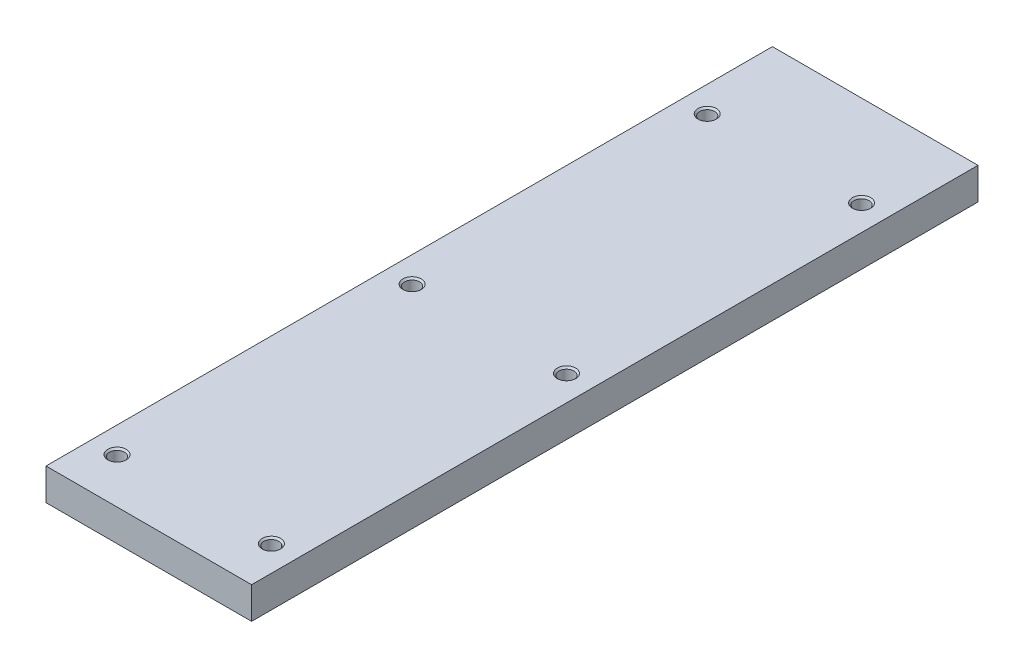
ISO-10303-21;
HEADER;
FILE_DESCRIPTION(('STEP AP214'),'2;1');
FILE_NAME('part.step','',(''),(''),'','','');
FILE_SCHEMA(('AUTOMOTIVE_DESIGN { 1 0 10303 214 1 1 1 1 }'));
ENDSEC;
DATA;
#1=APPLICATION_CONTEXT('core data for automotive mechanical design processes');
#2=APPLICATION_PROTOCOL_DEFINITION('international standard','automotive_design',2000,#1);
#3=PRODUCT_CONTEXT('',#1,'mechanical');
#4=PRODUCT('Part','Part','',(#3));
#5=PRODUCT_RELATED_PRODUCT_CATEGORY('part','',(#4));
#6=PRODUCT_DEFINITION_FORMATION('','',#4);
#7=PRODUCT_DEFINITION_CONTEXT('part definition',#1,'design');
#8=PRODUCT_DEFINITION('design','',#6,#7);
#9=PRODUCT_DEFINITION_SHAPE('','',#8);
#10=(LENGTH_UNIT() NAMED_UNIT(*) SI_UNIT(.MILLI.,.METRE.));
#11=(NAMED_UNIT(*) PLANE_ANGLE_UNIT() SI_UNIT($,.RADIAN.));
#12=(NAMED_UNIT(*) SI_UNIT($,.STERADIAN.) SOLID_ANGLE_UNIT());
#13=UNCERTAINTY_MEASURE_WITH_UNIT(LENGTH_MEASURE(1.E-05),#10,'distance_accuracy_value','');
#14=(GEOMETRIC_REPRESENTATION_CONTEXT(3) GLOBAL_UNCERTAINTY_ASSIGNED_CONTEXT((#13)) GLOBAL_UNIT_ASSIGNED_CONTEXT((#10,
#11,#12)) REPRESENTATION_CONTEXT('',''));
#15=CARTESIAN_POINT('',(0.,0.,0.));
#16=DIRECTION('',(0.,0.,1.));
#17=DIRECTION('',(1.,0.,0.));
#18=AXIS2_PLACEMENT_3D('',#15,#16,#17);
#19=CARTESIAN_POINT('',(-28.1439837484486,-5.96999999999999,205.825756949559));
#20=DIRECTION('',(1.,0.,0.));
#21=DIRECTION('',(0.,0.,-1.));
#22=AXIS2_PLACEMENT_3D('',#19,#20,#21);
#23=PLANE('',#22);
#24=DIRECTION('',(0.,-1.,0.));
#25=VECTOR('',#24,1.);
#26=CARTESIAN_POINT('',(-28.1439837484486,-5.96999999999999,160.));
#27=LINE('',#26,#25);
#28=CARTESIAN_POINT('',(-28.1439837484486,-5.96999999999999,160.));
#29=VERTEX_POINT('',#28);
#30=CARTESIAN_POINT('',(-28.1439837484486,-12.97,160.));
#31=VERTEX_POINT('',#30);
#32=EDGE_CURVE('E56',#29,#31,#27,.T.);
#33=ORIENTED_EDGE('',*,*,#32,.F.);
#34=DIRECTION('',(0.,0.,-1.));
#35=VECTOR('',#34,1.);
#36=CARTESIAN_POINT('',(-28.1439837484486,-5.96999999999999,205.825756949559));
#37=LINE('',#36,#35);
#38=CARTESIAN_POINT('',(-28.1439837484486,-5.96999999999999,0.));
#39=VERTEX_POINT('',#38);
#40=EDGE_CURVE('E51',#29,#39,#37,.T.);
#41=ORIENTED_EDGE('',*,*,#40,.T.);
#42=DIRECTION('',(0.,-1.,0.));
#43=VECTOR('',#42,1.);
#44=CARTESIAN_POINT('',(-28.1439837484486,-5.96999999999999,0.));
#45=LINE('',#44,#43);
#46=CARTESIAN_POINT('',(-28.1439837484486,-12.97,0.));
#47=VERTEX_POINT('',#46);
#48=EDGE_CURVE('E113',#39,#47,#45,.T.);
#49=ORIENTED_EDGE('',*,*,#48,.T.);
#50=DIRECTION('',(0.,0.,-1.));
#51=VECTOR('',#50,1.);
#52=CARTESIAN_POINT('',(-28.1439837484486,-12.97,205.825756949559));
#53=LINE('',#52,#51);
#54=EDGE_CURVE('E85',#31,#47,#53,.T.);
#55=ORIENTED_EDGE('',*,*,#54,.F.);
#56=EDGE_LOOP('',(#33,#41,#49,#55));
#57=FACE_BOUND('',#56,.T.);
#58=ADVANCED_FACE('F47',(#57),#23,.F.);
#59=CARTESIAN_POINT('',(-28.1439837484486,-12.97,205.825756949559));
#60=DIRECTION('',(0.,1.,0.));
#61=DIRECTION('',(0.,0.,1.));
#62=AXIS2_PLACEMENT_3D('',#59,#60,#61);
#63=PLANE('',#62);
#64=CARTESIAN_POINT('',(-22.5,-12.97,20.));
#65=DIRECTION('',(0.,1.,0.));
#66=DIRECTION('',(0.,0.,1.));
#67=AXIS2_PLACEMENT_3D('',#64,#65,#66);
#68=CIRCLE('',#67,1.65);
#69=CARTESIAN_POINT('',(-22.5,-12.97,21.65));
#70=VERTEX_POINT('',#69);
#71=EDGE_CURVE('E171',#70,#70,#68,.T.);
#72=ORIENTED_EDGE('',*,*,#71,.T.);
#73=EDGE_LOOP('',(#72));
#74=FACE_BOUND('',#73,.T.);
#75=CARTESIAN_POINT('',(-22.5,-12.97,85.));
#76=DIRECTION('',(0.,1.,0.));
#77=DIRECTION('',(0.,0.,1.));
#78=AXIS2_PLACEMENT_3D('',#75,#76,#77);
#79=CIRCLE('',#78,1.65);
#80=CARTESIAN_POINT('',(-22.5,-12.97,86.65));
#81=VERTEX_POINT('',#80);
#82=EDGE_CURVE('E162',#81,#81,#79,.T.);
#83=ORIENTED_EDGE('',*,*,#82,.T.);
#84=EDGE_LOOP('',(#83));
#85=FACE_BOUND('',#84,.T.);
#86=CARTESIAN_POINT('',(-22.5000000000001,-12.97,150.));
#87=DIRECTION('',(0.,1.,0.));
#88=DIRECTION('',(0.,0.,1.));
#89=AXIS2_PLACEMENT_3D('',#86,#87,#88);
#90=CIRCLE('',#89,1.65);
#91=CARTESIAN_POINT('',(-22.5000000000001,-12.97,151.65));
#92=VERTEX_POINT('',#91);
#93=EDGE_CURVE('E153',#92,#92,#90,.T.);
#94=ORIENTED_EDGE('',*,*,#93,.T.);
#95=EDGE_LOOP('',(#94));
#96=FACE_BOUND('',#95,.T.);
#97=CARTESIAN_POINT('',(11.5,-12.97,150.));
#98=DIRECTION('',(0.,1.,0.));
#99=DIRECTION('',(0.,0.,1.));
#100=AXIS2_PLACEMENT_3D('',#97,#98,#99);
#101=CIRCLE('',#100,1.65);
#102=CARTESIAN_POINT('',(11.5,-12.97,151.65));
#103=VERTEX_POINT('',#102);
#104=EDGE_CURVE('E144',#103,#103,#101,.T.);
#105=ORIENTED_EDGE('',*,*,#104,.T.);
#106=EDGE_LOOP('',(#105));
#107=FACE_BOUND('',#106,.T.);
#108=CARTESIAN_POINT('',(11.5,-12.97,85.));
#109=DIRECTION('',(0.,1.,0.));
#110=DIRECTION('',(0.,0.,1.));
#111=AXIS2_PLACEMENT_3D('',#108,#109,#110);
#112=CIRCLE('',#111,1.65);
#113=CARTESIAN_POINT('',(11.5,-12.97,86.65));
#114=VERTEX_POINT('',#113);
#115=EDGE_CURVE('E133',#114,#114,#112,.T.);
#116=ORIENTED_EDGE('',*,*,#115,.T.);
#117=EDGE_LOOP('',(#116));
#118=FACE_BOUND('',#117,.T.);
#119=CARTESIAN_POINT('',(11.5,-12.97,20.));
#120=DIRECTION('',(0.,1.,0.));
#121=DIRECTION('',(0.,0.,1.));
#122=AXIS2_PLACEMENT_3D('',#119,#120,#121);
#123=CIRCLE('',#122,1.65);
#124=CARTESIAN_POINT('',(11.5,-12.97,21.65));
#125=VERTEX_POINT('',#124);
#126=EDGE_CURVE('E119',#125,#125,#123,.T.);
#127=ORIENTED_EDGE('',*,*,#126,.T.);
#128=EDGE_LOOP('',(#127));
#129=FACE_BOUND('',#128,.T.);
#130=DIRECTION('',(1.,0.,0.));
#131=VECTOR('',#130,1.);
#132=CARTESIAN_POINT('',(-28.1439837484486,-12.97,160.));
#133=LINE('',#132,#131);
#134=CARTESIAN_POINT('',(17.1439837484486,-12.97,160.));
#135=VERTEX_POINT('',#134);
#136=EDGE_CURVE('E13',#31,#135,#133,.T.);
#137=ORIENTED_EDGE('',*,*,#136,.F.);
#138=ORIENTED_EDGE('',*,*,#54,.T.);
#139=DIRECTION('',(1.,0.,0.));
#140=VECTOR('',#139,1.);
#141=CARTESIAN_POINT('',(-28.1439837484486,-12.97,0.));
#142=LINE('',#141,#140);
#143=CARTESIAN_POINT('',(17.1439837484486,-12.97,0.));
#144=VERTEX_POINT('',#143);
#145=EDGE_CURVE('E101',#47,#144,#142,.T.);
#146=ORIENTED_EDGE('',*,*,#145,.T.);
#147=DIRECTION('',(0.,0.,-1.));
#148=VECTOR('',#147,1.);
#149=CARTESIAN_POINT('',(17.1439837484486,-12.97,205.825756949559));
#150=LINE('',#149,#148);
#151=EDGE_CURVE('E98',#135,#144,#150,.T.);
#152=ORIENTED_EDGE('',*,*,#151,.F.);
#153=EDGE_LOOP('',(#137,#138,#146,#152));
#154=FACE_BOUND('',#153,.T.);
#155=ADVANCED_FACE('F103',(#74,#85,#96,#107,#118,#129,#154),#63,.F.);
#156=CARTESIAN_POINT('',(17.1439837484486,-5.96999999999999,205.825756949559));
#157=DIRECTION('',(1.,0.,0.));
#158=DIRECTION('',(0.,0.,-1.));
#159=AXIS2_PLACEMENT_3D('',#156,#157,#158);
#160=PLANE('',#159);
#161=DIRECTION('',(0.,0.,-1.));
#162=VECTOR('',#161,1.);
#163=CARTESIAN_POINT('',(17.1439837484486,-5.96999999999999,205.825756949559));
#164=LINE('',#163,#162);
#165=CARTESIAN_POINT('',(17.1439837484486,-5.96999999999999,160.));
#166=VERTEX_POINT('',#165);
#167=CARTESIAN_POINT('',(17.1439837484486,-5.96999999999999,0.));
#168=VERTEX_POINT('',#167);
#169=EDGE_CURVE('E69',#166,#168,#164,.T.);
#170=ORIENTED_EDGE('',*,*,#169,.F.);
#171=DIRECTION('',(0.,-1.,0.));
#172=VECTOR('',#171,1.);
#173=CARTESIAN_POINT('',(17.1439837484486,-5.96999999999999,160.));
#174=LINE('',#173,#172);
#175=EDGE_CURVE('E95',#166,#135,#174,.T.);
#176=ORIENTED_EDGE('',*,*,#175,.T.);
#177=ORIENTED_EDGE('',*,*,#151,.T.);
#178=DIRECTION('',(0.,-1.,0.));
#179=VECTOR('',#178,1.);
#180=CARTESIAN_POINT('',(17.1439837484486,-5.96999999999999,0.));
#181=LINE('',#180,#179);
#182=EDGE_CURVE('E110',#168,#144,#181,.T.);
#183=ORIENTED_EDGE('',*,*,#182,.F.);
#184=EDGE_LOOP('',(#170,#176,#177,#183));
#185=FACE_BOUND('',#184,.T.);
#186=ADVANCED_FACE('F96',(#185),#160,.T.);
#187=CARTESIAN_POINT('',(17.1439837484486,-5.96999999999999,205.825756949559));
#188=DIRECTION('',(0.,-1.,0.));
#189=DIRECTION('',(0.,0.,-1.));
#190=AXIS2_PLACEMENT_3D('',#187,#188,#189);
#191=PLANE('',#190);
#192=CARTESIAN_POINT('',(-22.5,-5.97,20.));
#193=DIRECTION('',(0.,1.,0.));
#194=DIRECTION('',(0.,0.,1.));
#195=AXIS2_PLACEMENT_3D('',#192,#193,#194);
#196=CIRCLE('',#195,2.025);
#197=CARTESIAN_POINT('',(-22.5,-5.97,22.025));
#198=VERTEX_POINT('',#197);
#199=EDGE_CURVE('E177',#198,#198,#196,.T.);
#200=ORIENTED_EDGE('',*,*,#199,.F.);
#201=EDGE_LOOP('',(#200));
#202=FACE_BOUND('',#201,.T.);
#203=CARTESIAN_POINT('',(-22.5,-5.97,85.));
#204=DIRECTION('',(0.,1.,0.));
#205=DIRECTION('',(0.,0.,1.));
#206=AXIS2_PLACEMENT_3D('',#203,#204,#205);
#207=CIRCLE('',#206,2.025);
#208=CARTESIAN_POINT('',(-22.5,-5.97,87.025));
#209=VERTEX_POINT('',#208);
#210=EDGE_CURVE('E168',#209,#209,#207,.T.);
#211=ORIENTED_EDGE('',*,*,#210,.F.);
#212=EDGE_LOOP('',(#211));
#213=FACE_BOUND('',#212,.T.);
#214=CARTESIAN_POINT('',(-22.5000000000001,-5.97,150.));
#215=DIRECTION('',(0.,1.,0.));
#216=DIRECTION('',(0.,0.,1.));
#217=AXIS2_PLACEMENT_3D('',#214,#215,#216);
#218=CIRCLE('',#217,2.025);
#219=CARTESIAN_POINT('',(-22.5000000000001,-5.97,152.025));
#220=VERTEX_POINT('',#219);
#221=EDGE_CURVE('E159',#220,#220,#218,.T.);
#222=ORIENTED_EDGE('',*,*,#221,.F.);
#223=EDGE_LOOP('',(#222));
#224=FACE_BOUND('',#223,.T.);
#225=CARTESIAN_POINT('',(11.5,-5.96999999999999,150.));
#226=DIRECTION('',(0.,1.,0.));
#227=DIRECTION('',(0.,0.,1.));
#228=AXIS2_PLACEMENT_3D('',#225,#226,#227);
#229=CIRCLE('',#228,2.025);
#230=CARTESIAN_POINT('',(11.5,-5.96999999999999,152.025));
#231=VERTEX_POINT('',#230);
#232=EDGE_CURVE('E150',#231,#231,#229,.T.);
#233=ORIENTED_EDGE('',*,*,#232,.F.);
#234=EDGE_LOOP('',(#233));
#235=FACE_BOUND('',#234,.T.);
#236=CARTESIAN_POINT('',(11.5,-5.96999999999999,85.));
#237=DIRECTION('',(0.,1.,0.));
#238=DIRECTION('',(0.,0.,1.));
#239=AXIS2_PLACEMENT_3D('',#236,#237,#238);
#240=CIRCLE('',#239,2.025);
#241=CARTESIAN_POINT('',(11.5,-5.96999999999999,87.025));
#242=VERTEX_POINT('',#241);
#243=EDGE_CURVE('E141',#242,#242,#240,.T.);
#244=ORIENTED_EDGE('',*,*,#243,.F.);
#245=EDGE_LOOP('',(#244));
#246=FACE_BOUND('',#245,.T.);
#247=CARTESIAN_POINT('',(11.5,-5.96999999999999,20.));
#248=DIRECTION('',(0.,1.,0.));
#249=DIRECTION('',(0.,0.,1.));
#250=AXIS2_PLACEMENT_3D('',#247,#248,#249);
#251=CIRCLE('',#250,2.025);
#252=CARTESIAN_POINT('',(11.5,-5.96999999999999,22.025));
#253=VERTEX_POINT('',#252);
#254=EDGE_CURVE('E129',#253,#253,#251,.T.);
#255=ORIENTED_EDGE('',*,*,#254,.F.);
#256=EDGE_LOOP('',(#255));
#257=FACE_BOUND('',#256,.T.);
#258=DIRECTION('',(-1.,0.,0.));
#259=VECTOR('',#258,1.);
#260=CARTESIAN_POINT('',(17.1439837484486,-5.96999999999999,160.));
#261=LINE('',#260,#259);
#262=EDGE_CURVE('E107',#166,#29,#261,.T.);
#263=ORIENTED_EDGE('',*,*,#262,.F.);
#264=ORIENTED_EDGE('',*,*,#169,.T.);
#265=DIRECTION('',(-1.,0.,0.));
#266=VECTOR('',#265,1.);
#267=CARTESIAN_POINT('',(17.1439837484486,-5.96999999999999,0.));
#268=LINE('',#267,#266);
#269=EDGE_CURVE('E114',#168,#39,#268,.T.);
#270=ORIENTED_EDGE('',*,*,#269,.T.);
#271=ORIENTED_EDGE('',*,*,#40,.F.);
#272=EDGE_LOOP('',(#263,#264,#270,#271));
#273=FACE_BOUND('',#272,.T.);
#274=ADVANCED_FACE('F195',(#202,#213,#224,#235,#246,#257,#273),#191,.F.);
#275=CARTESIAN_POINT('',(0.,0.,0.));
#276=DIRECTION('',(0.,0.,1.));
#277=DIRECTION('',(1.,0.,0.));
#278=AXIS2_PLACEMENT_3D('',#275,#276,#277);
#279=PLANE('',#278);
#280=CARTESIAN_POINT('',(-5.5,-9.46999999999998,0.));
#281=DIRECTION('',(0.,0.,-1.));
#282=DIRECTION('',(-1.,0.,0.));
#283=AXIS2_PLACEMENT_3D('',#280,#281,#282);
#284=CIRCLE('',#283,2.525);
#285=CARTESIAN_POINT('',(-8.02499999999999,-9.46999999999998,0.));
#286=VERTEX_POINT('',#285);
#287=EDGE_CURVE('E186',#286,#286,#284,.T.);
#288=ORIENTED_EDGE('',*,*,#287,.F.);
#289=EDGE_LOOP('',(#288));
#290=FACE_BOUND('',#289,.T.);
#291=ORIENTED_EDGE('',*,*,#48,.F.);
#292=ORIENTED_EDGE('',*,*,#269,.F.);
#293=ORIENTED_EDGE('',*,*,#182,.T.);
#294=ORIENTED_EDGE('',*,*,#145,.F.);
#295=EDGE_LOOP('',(#291,#292,#293,#294));
#296=FACE_BOUND('',#295,.T.);
#297=ADVANCED_FACE('F192',(#290,#296),#279,.F.);
#298=CARTESIAN_POINT('',(0.,0.,160.));
#299=DIRECTION('',(0.,0.,1.));
#300=DIRECTION('',(1.,0.,0.));
#301=AXIS2_PLACEMENT_3D('',#298,#299,#300);
#302=PLANE('',#301);
#303=ORIENTED_EDGE('',*,*,#262,.T.);
#304=ORIENTED_EDGE('',*,*,#32,.T.);
#305=ORIENTED_EDGE('',*,*,#136,.T.);
#306=ORIENTED_EDGE('',*,*,#175,.F.);
#307=EDGE_LOOP('',(#303,#304,#305,#306));
#308=FACE_BOUND('',#307,.T.);
#309=ADVANCED_FACE('F49',(#308),#302,.T.);
#310=CARTESIAN_POINT('',(11.5,-5.96999999999999,20.));
#311=DIRECTION('',(0.,1.,0.));
#312=DIRECTION('',(0.,0.,1.));
#313=AXIS2_PLACEMENT_3D('',#310,#311,#312);
#314=CYLINDRICAL_SURFACE('',#313,1.65);
#315=ORIENTED_EDGE('',*,*,#126,.F.);
#316=EDGE_LOOP('',(#315));
#317=FACE_BOUND('',#316,.T.);
#318=CARTESIAN_POINT('',(11.5,-6.34499999999999,20.));
#319=DIRECTION('',(0.,1.,0.));
#320=DIRECTION('',(0.,0.,1.));
#321=AXIS2_PLACEMENT_3D('',#318,#319,#320);
#322=CIRCLE('',#321,1.65);
#323=CARTESIAN_POINT('',(11.5,-6.34499999999999,21.65));
#324=VERTEX_POINT('',#323);
#325=EDGE_CURVE('E125',#324,#324,#322,.T.);
#326=ORIENTED_EDGE('',*,*,#325,.T.);
#327=EDGE_LOOP('',(#326));
#328=FACE_BOUND('',#327,.T.);
#329=ADVANCED_FACE('F201',(#317,#328),#314,.F.);
#330=CARTESIAN_POINT('',(11.5,-5.96999999999999,20.));
#331=DIRECTION('',(0.,1.,0.));
#332=DIRECTION('',(0.,0.,1.));
#333=AXIS2_PLACEMENT_3D('',#330,#331,#332);
#334=CONICAL_SURFACE('',#333,2.025,0.785398163397447);
#335=ORIENTED_EDGE('',*,*,#325,.F.);
#336=EDGE_LOOP('',(#335));
#337=FACE_BOUND('',#336,.T.);
#338=ORIENTED_EDGE('',*,*,#254,.T.);
#339=EDGE_LOOP('',(#338));
#340=FACE_BOUND('',#339,.T.);
#341=ADVANCED_FACE('F235',(#337,#340),#334,.F.);
#342=CARTESIAN_POINT('',(11.5,-5.96999999999999,85.));
#343=DIRECTION('',(0.,1.,0.));
#344=DIRECTION('',(0.,0.,1.));
#345=AXIS2_PLACEMENT_3D('',#342,#343,#344);
#346=CYLINDRICAL_SURFACE('',#345,1.65);
#347=ORIENTED_EDGE('',*,*,#115,.F.);
#348=EDGE_LOOP('',(#347));
#349=FACE_BOUND('',#348,.T.);
#350=CARTESIAN_POINT('',(11.5,-6.34499999999999,85.));
#351=DIRECTION('',(0.,1.,0.));
#352=DIRECTION('',(0.,0.,1.));
#353=AXIS2_PLACEMENT_3D('',#350,#351,#352);
#354=CIRCLE('',#353,1.65);
#355=CARTESIAN_POINT('',(11.5,-6.34499999999999,86.65));
#356=VERTEX_POINT('',#355);
#357=EDGE_CURVE('E138',#356,#356,#354,.T.);
#358=ORIENTED_EDGE('',*,*,#357,.T.);
#359=EDGE_LOOP('',(#358));
#360=FACE_BOUND('',#359,.T.);
#361=ADVANCED_FACE('F247',(#349,#360),#346,.F.);
#362=CARTESIAN_POINT('',(11.5,-5.96999999999999,85.));
#363=DIRECTION('',(0.,1.,0.));
#364=DIRECTION('',(0.,0.,1.));
#365=AXIS2_PLACEMENT_3D('',#362,#363,#364);
#366=CONICAL_SURFACE('',#365,2.025,0.785398163397447);
#367=ORIENTED_EDGE('',*,*,#357,.F.);
#368=EDGE_LOOP('',(#367));
#369=FACE_BOUND('',#368,.T.);
#370=ORIENTED_EDGE('',*,*,#243,.T.);
#371=EDGE_LOOP('',(#370));
#372=FACE_BOUND('',#371,.T.);
#373=ADVANCED_FACE('F257',(#369,#372),#366,.F.);
#374=CARTESIAN_POINT('',(11.5,-5.96999999999999,150.));
#375=DIRECTION('',(0.,1.,0.));
#376=DIRECTION('',(0.,0.,1.));
#377=AXIS2_PLACEMENT_3D('',#374,#375,#376);
#378=CYLINDRICAL_SURFACE('',#377,1.65);
#379=ORIENTED_EDGE('',*,*,#104,.F.);
#380=EDGE_LOOP('',(#379));
#381=FACE_BOUND('',#380,.T.);
#382=CARTESIAN_POINT('',(11.5,-6.34499999999999,150.));
#383=DIRECTION('',(0.,1.,0.));
#384=DIRECTION('',(0.,0.,1.));
#385=AXIS2_PLACEMENT_3D('',#382,#383,#384);
#386=CIRCLE('',#385,1.65);
#387=CARTESIAN_POINT('',(11.5,-6.34499999999999,151.65));
#388=VERTEX_POINT('',#387);
#389=EDGE_CURVE('E147',#388,#388,#386,.T.);
#390=ORIENTED_EDGE('',*,*,#389,.T.);
#391=EDGE_LOOP('',(#390));
#392=FACE_BOUND('',#391,.T.);
#393=ADVANCED_FACE('F268',(#381,#392),#378,.F.);
#394=CARTESIAN_POINT('',(11.5,-5.96999999999999,150.));
#395=DIRECTION('',(0.,1.,0.));
#396=DIRECTION('',(0.,0.,1.));
#397=AXIS2_PLACEMENT_3D('',#394,#395,#396);
#398=CONICAL_SURFACE('',#397,2.025,0.785398163397447);
#399=ORIENTED_EDGE('',*,*,#389,.F.);
#400=EDGE_LOOP('',(#399));
#401=FACE_BOUND('',#400,.T.);
#402=ORIENTED_EDGE('',*,*,#232,.T.);
#403=EDGE_LOOP('',(#402));
#404=FACE_BOUND('',#403,.T.);
#405=ADVANCED_FACE('F278',(#401,#404),#398,.F.);
#406=CARTESIAN_POINT('',(-22.5000000000001,-5.97,150.));
#407=DIRECTION('',(0.,1.,0.));
#408=DIRECTION('',(0.,0.,1.));
#409=AXIS2_PLACEMENT_3D('',#406,#407,#408);
#410=CYLINDRICAL_SURFACE('',#409,1.65);
#411=ORIENTED_EDGE('',*,*,#93,.F.);
#412=EDGE_LOOP('',(#411));
#413=FACE_BOUND('',#412,.T.);
#414=CARTESIAN_POINT('',(-22.5000000000001,-6.345,150.));
#415=DIRECTION('',(0.,1.,0.));
#416=DIRECTION('',(0.,0.,1.));
#417=AXIS2_PLACEMENT_3D('',#414,#415,#416);
#418=CIRCLE('',#417,1.65);
#419=CARTESIAN_POINT('',(-22.5000000000001,-6.345,151.65));
#420=VERTEX_POINT('',#419);
#421=EDGE_CURVE('E156',#420,#420,#418,.T.);
#422=ORIENTED_EDGE('',*,*,#421,.T.);
#423=EDGE_LOOP('',(#422));
#424=FACE_BOUND('',#423,.T.);
#425=ADVANCED_FACE('F288',(#413,#424),#410,.F.);
#426=CARTESIAN_POINT('',(-22.5000000000001,-5.97,150.));
#427=DIRECTION('',(0.,1.,0.));
#428=DIRECTION('',(0.,0.,1.));
#429=AXIS2_PLACEMENT_3D('',#426,#427,#428);
#430=CONICAL_SURFACE('',#429,2.025,0.785398163397447);
#431=ORIENTED_EDGE('',*,*,#421,.F.);
#432=EDGE_LOOP('',(#431));
#433=FACE_BOUND('',#432,.T.);
#434=ORIENTED_EDGE('',*,*,#221,.T.);
#435=EDGE_LOOP('',(#434));
#436=FACE_BOUND('',#435,.T.);
#437=ADVANCED_FACE('F299',(#433,#436),#430,.F.);
#438=CARTESIAN_POINT('',(-22.5,-5.97,85.));
#439=DIRECTION('',(0.,1.,0.));
#440=DIRECTION('',(0.,0.,1.));
#441=AXIS2_PLACEMENT_3D('',#438,#439,#440);
#442=CYLINDRICAL_SURFACE('',#441,1.65);
#443=ORIENTED_EDGE('',*,*,#82,.F.);
#444=EDGE_LOOP('',(#443));
#445=FACE_BOUND('',#444,.T.);
#446=CARTESIAN_POINT('',(-22.5,-6.345,85.));
#447=DIRECTION('',(0.,1.,0.));
#448=DIRECTION('',(0.,0.,1.));
#449=AXIS2_PLACEMENT_3D('',#446,#447,#448);
#450=CIRCLE('',#449,1.65);
#451=CARTESIAN_POINT('',(-22.5,-6.345,86.65));
#452=VERTEX_POINT('',#451);
#453=EDGE_CURVE('E165',#452,#452,#450,.T.);
#454=ORIENTED_EDGE('',*,*,#453,.T.);
#455=EDGE_LOOP('',(#454));
#456=FACE_BOUND('',#455,.T.);
#457=ADVANCED_FACE('F311',(#445,#456),#442,.F.);
#458=CARTESIAN_POINT('',(-22.5,-5.97,85.));
#459=DIRECTION('',(0.,1.,0.));
#460=DIRECTION('',(0.,0.,1.));
#461=AXIS2_PLACEMENT_3D('',#458,#459,#460);
#462=CONICAL_SURFACE('',#461,2.025,0.785398163397447);
#463=ORIENTED_EDGE('',*,*,#453,.F.);
#464=EDGE_LOOP('',(#463));
#465=FACE_BOUND('',#464,.T.);
#466=ORIENTED_EDGE('',*,*,#210,.T.);
#467=EDGE_LOOP('',(#466));
#468=FACE_BOUND('',#467,.T.);
#469=ADVANCED_FACE('F321',(#465,#468),#462,.F.);
#470=CARTESIAN_POINT('',(-22.5,-5.97,20.));
#471=DIRECTION('',(0.,1.,0.));
#472=DIRECTION('',(0.,0.,1.));
#473=AXIS2_PLACEMENT_3D('',#470,#471,#472);
#474=CYLINDRICAL_SURFACE('',#473,1.65);
#475=ORIENTED_EDGE('',*,*,#71,.F.);
#476=EDGE_LOOP('',(#475));
#477=FACE_BOUND('',#476,.T.);
#478=CARTESIAN_POINT('',(-22.5,-6.345,20.));
#479=DIRECTION('',(0.,1.,0.));
#480=DIRECTION('',(0.,0.,1.));
#481=AXIS2_PLACEMENT_3D('',#478,#479,#480);
#482=CIRCLE('',#481,1.65);
#483=CARTESIAN_POINT('',(-22.5,-6.345,21.65));
#484=VERTEX_POINT('',#483);
#485=EDGE_CURVE('E174',#484,#484,#482,.T.);
#486=ORIENTED_EDGE('',*,*,#485,.T.);
#487=EDGE_LOOP('',(#486));
#488=FACE_BOUND('',#487,.T.);
#489=ADVANCED_FACE('F331',(#477,#488),#474,.F.);
#490=CARTESIAN_POINT('',(-22.5,-5.97,20.));
#491=DIRECTION('',(0.,1.,0.));
#492=DIRECTION('',(0.,0.,1.));
#493=AXIS2_PLACEMENT_3D('',#490,#491,#492);
#494=CONICAL_SURFACE('',#493,2.025,0.785398163397447);
#495=ORIENTED_EDGE('',*,*,#485,.F.);
#496=EDGE_LOOP('',(#495));
#497=FACE_BOUND('',#496,.T.);
#498=ORIENTED_EDGE('',*,*,#199,.T.);
#499=EDGE_LOOP('',(#498));
#500=FACE_BOUND('',#499,.T.);
#501=ADVANCED_FACE('F341',(#497,#500),#494,.F.);
#502=CARTESIAN_POINT('',(-5.5,-9.46999999999998,50.));
#503=DIRECTION('',(0.,0.,-1.));
#504=DIRECTION('',(-1.,0.,0.));
#505=AXIS2_PLACEMENT_3D('',#502,#503,#504);
#506=CONICAL_SURFACE('',#505,2.09999999999999,1.02974425867665);
#507=CARTESIAN_POINT('',(-5.50000000000001,-9.46999999999998,51.2618072999579));
#508=VERTEX_POINT('',#507);
#509=VERTEX_LOOP('',#508);
#510=FACE_BOUND('',#509,.T.);
#511=CARTESIAN_POINT('',(-5.5,-9.46999999999998,50.));
#512=DIRECTION('',(0.,0.,-1.));
#513=DIRECTION('',(-1.,0.,0.));
#514=AXIS2_PLACEMENT_3D('',#511,#512,#513);
#515=CIRCLE('',#514,2.09999999999999);
#516=CARTESIAN_POINT('',(-7.59999999999999,-9.46999999999998,50.));
#517=VERTEX_POINT('',#516);
#518=EDGE_CURVE('E180',#517,#517,#515,.T.);
#519=ORIENTED_EDGE('',*,*,#518,.T.);
#520=EDGE_LOOP('',(#519));
#521=FACE_BOUND('',#520,.T.);
#522=ADVANCED_FACE('F350',(#510,#521),#506,.F.);
#523=CARTESIAN_POINT('',(-5.5,-9.46999999999998,0.));
#524=DIRECTION('',(0.,0.,-1.));
#525=DIRECTION('',(-1.,0.,0.));
#526=AXIS2_PLACEMENT_3D('',#523,#524,#525);
#527=CYLINDRICAL_SURFACE('',#526,2.09999999999999);
#528=ORIENTED_EDGE('',*,*,#518,.F.);
#529=EDGE_LOOP('',(#528));
#530=FACE_BOUND('',#529,.T.);
#531=CARTESIAN_POINT('',(-5.5,-9.46999999999998,0.424999999999998));
#532=DIRECTION('',(0.,0.,-1.));
#533=DIRECTION('',(-1.,0.,0.));
#534=AXIS2_PLACEMENT_3D('',#531,#532,#533);
#535=CIRCLE('',#534,2.1);
#536=CARTESIAN_POINT('',(-7.6,-9.46999999999998,0.424999999999998));
#537=VERTEX_POINT('',#536);
#538=EDGE_CURVE('E183',#537,#537,#535,.T.);
#539=ORIENTED_EDGE('',*,*,#538,.T.);
#540=EDGE_LOOP('',(#539));
#541=FACE_BOUND('',#540,.T.);
#542=ADVANCED_FACE('F364',(#530,#541),#527,.F.);
#543=CARTESIAN_POINT('',(-5.5,-9.46999999999998,0.));
#544=DIRECTION('',(0.,0.,-1.));
#545=DIRECTION('',(-1.,0.,0.));
#546=AXIS2_PLACEMENT_3D('',#543,#544,#545);
#547=CONICAL_SURFACE('',#546,2.525,0.785398163397448);
#548=ORIENTED_EDGE('',*,*,#538,.F.);
#549=EDGE_LOOP('',(#548));
#550=FACE_BOUND('',#549,.T.);
#551=ORIENTED_EDGE('',*,*,#287,.T.);
#552=EDGE_LOOP('',(#551));
#553=FACE_BOUND('',#552,.T.);
#554=ADVANCED_FACE('F190',(#550,#553),#547,.F.);
#555=CLOSED_SHELL('',(#58,#155,#186,#274,#297,#309,#329,#341,#361,#373,#393,#405,#425,#437,#457,
#469,#489,#501,#522,#542,#554));
#556=MANIFOLD_SOLID_BREP('B2',#555);
#557=ADVANCED_BREP_SHAPE_REPRESENTATION('',(#18,#556),#14);
#558=SHAPE_DEFINITION_REPRESENTATION(#9,#557);
ENDSEC;
END-ISO-10303-21;
